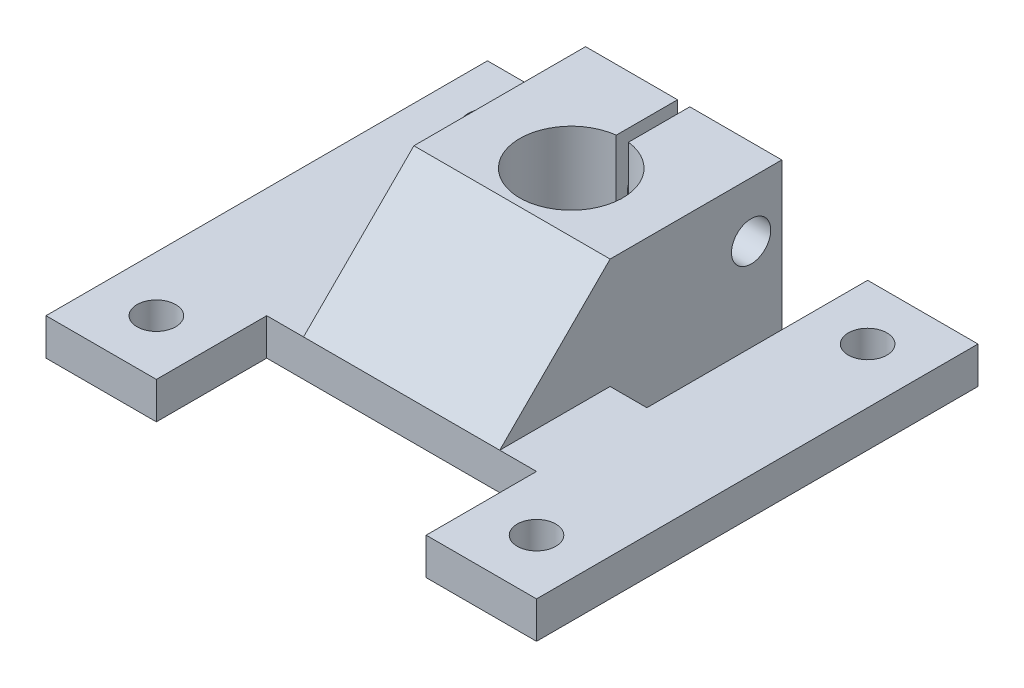
ISO-10303-21;
HEADER;
FILE_DESCRIPTION(('STEP AP214'),'2;1');
FILE_NAME('part.step','',(''),(''),'','','');
FILE_SCHEMA(('AUTOMOTIVE_DESIGN { 1 0 10303 214 1 1 1 1 }'));
ENDSEC;
DATA;
#1=APPLICATION_CONTEXT('core data for automotive mechanical design processes');
#2=APPLICATION_PROTOCOL_DEFINITION('international standard','automotive_design',2000,#1);
#3=PRODUCT_CONTEXT('',#1,'mechanical');
#4=PRODUCT('Part','Part','',(#3));
#5=PRODUCT_RELATED_PRODUCT_CATEGORY('part','',(#4));
#6=PRODUCT_DEFINITION_FORMATION('','',#4);
#7=PRODUCT_DEFINITION_CONTEXT('part definition',#1,'design');
#8=PRODUCT_DEFINITION('design','',#6,#7);
#9=PRODUCT_DEFINITION_SHAPE('','',#8);
#10=(LENGTH_UNIT() NAMED_UNIT(*) SI_UNIT(.MILLI.,.METRE.));
#11=(NAMED_UNIT(*) PLANE_ANGLE_UNIT() SI_UNIT($,.RADIAN.));
#12=(NAMED_UNIT(*) SI_UNIT($,.STERADIAN.) SOLID_ANGLE_UNIT());
#13=UNCERTAINTY_MEASURE_WITH_UNIT(LENGTH_MEASURE(1.E-05),#10,'distance_accuracy_value','');
#14=(GEOMETRIC_REPRESENTATION_CONTEXT(3) GLOBAL_UNCERTAINTY_ASSIGNED_CONTEXT((#13)) GLOBAL_UNIT_ASSIGNED_CONTEXT((#10,
#11,#12)) REPRESENTATION_CONTEXT('',''));
#15=CARTESIAN_POINT('',(0.,0.,0.));
#16=DIRECTION('',(0.,0.,1.));
#17=DIRECTION('',(1.,0.,0.));
#18=AXIS2_PLACEMENT_3D('',#15,#16,#17);
#19=CARTESIAN_POINT('',(0.,3.,0.));
#20=DIRECTION('',(0.,1.,0.));
#21=DIRECTION('',(0.,0.,1.));
#22=AXIS2_PLACEMENT_3D('',#19,#20,#21);
#23=PLANE('',#22);
#24=CARTESIAN_POINT('',(35.4999999999998,3.,4.5));
#25=DIRECTION('',(0.,1.,0.));
#26=DIRECTION('',(0.,0.,1.));
#27=AXIS2_PLACEMENT_3D('',#24,#25,#26);
#28=CIRCLE('',#27,1.575);
#29=CARTESIAN_POINT('',(35.4999999999998,3.,6.075));
#30=VERTEX_POINT('',#29);
#31=EDGE_CURVE('E199',#30,#30,#28,.F.);
#32=ORIENTED_EDGE('',*,*,#31,.T.);
#33=EDGE_LOOP('',(#32));
#34=FACE_BOUND('',#33,.T.);
#35=CARTESIAN_POINT('',(35.5,3.,31.5));
#36=DIRECTION('',(0.,1.,0.));
#37=DIRECTION('',(0.,0.,1.));
#38=AXIS2_PLACEMENT_3D('',#35,#36,#37);
#39=CIRCLE('',#38,1.575);
#40=CARTESIAN_POINT('',(35.5,3.,33.075));
#41=VERTEX_POINT('',#40);
#42=EDGE_CURVE('E196',#41,#41,#39,.F.);
#43=ORIENTED_EDGE('',*,*,#42,.T.);
#44=EDGE_LOOP('',(#43));
#45=FACE_BOUND('',#44,.T.);
#46=DIRECTION('',(1.,0.,0.));
#47=VECTOR('',#46,1.);
#48=CARTESIAN_POINT('',(0.,3.,18.));
#49=LINE('',#48,#47);
#50=CARTESIAN_POINT('',(28.,3.,18.));
#51=VERTEX_POINT('',#50);
#52=CARTESIAN_POINT('',(31.,3.,18.));
#53=VERTEX_POINT('',#52);
#54=EDGE_CURVE('E190',#51,#53,#49,.T.);
#55=ORIENTED_EDGE('',*,*,#54,.F.);
#56=DIRECTION('',(0.,0.,1.));
#57=VECTOR('',#56,1.);
#58=CARTESIAN_POINT('',(28.,3.,0.));
#59=LINE('',#58,#57);
#60=CARTESIAN_POINT('',(28.,3.,27.));
#61=VERTEX_POINT('',#60);
#62=EDGE_CURVE('E385',#51,#61,#59,.T.);
#63=ORIENTED_EDGE('',*,*,#62,.T.);
#64=DIRECTION('',(-1.,0.,0.));
#65=VECTOR('',#64,1.);
#66=CARTESIAN_POINT('',(0.,3.,27.));
#67=LINE('',#66,#65);
#68=CARTESIAN_POINT('',(31.,3.,27.));
#69=VERTEX_POINT('',#68);
#70=EDGE_CURVE('E361',#69,#61,#67,.T.);
#71=ORIENTED_EDGE('',*,*,#70,.F.);
#72=DIRECTION('',(0.,0.,-1.));
#73=VECTOR('',#72,1.);
#74=CARTESIAN_POINT('',(31.,3.,0.));
#75=LINE('',#74,#73);
#76=CARTESIAN_POINT('',(31.,3.,36.));
#77=VERTEX_POINT('',#76);
#78=EDGE_CURVE('E364',#77,#69,#75,.T.);
#79=ORIENTED_EDGE('',*,*,#78,.F.);
#80=DIRECTION('',(-1.,0.,0.));
#81=VECTOR('',#80,1.);
#82=CARTESIAN_POINT('',(0.,3.,36.));
#83=LINE('',#82,#81);
#84=CARTESIAN_POINT('',(40.,3.,36.));
#85=VERTEX_POINT('',#84);
#86=EDGE_CURVE('E185',#85,#77,#83,.T.);
#87=ORIENTED_EDGE('',*,*,#86,.F.);
#88=DIRECTION('',(0.,0.,1.));
#89=VECTOR('',#88,1.);
#90=CARTESIAN_POINT('',(40.,3.,0.));
#91=LINE('',#90,#89);
#92=CARTESIAN_POINT('',(40.,3.,0.));
#93=VERTEX_POINT('',#92);
#94=EDGE_CURVE('E168',#93,#85,#91,.T.);
#95=ORIENTED_EDGE('',*,*,#94,.F.);
#96=DIRECTION('',(1.,0.,0.));
#97=VECTOR('',#96,1.);
#98=CARTESIAN_POINT('',(0.,3.,0.));
#99=LINE('',#98,#97);
#100=CARTESIAN_POINT('',(31.,3.,0.));
#101=VERTEX_POINT('',#100);
#102=EDGE_CURVE('E182',#101,#93,#99,.T.);
#103=ORIENTED_EDGE('',*,*,#102,.F.);
#104=DIRECTION('',(0.,0.,-1.));
#105=VECTOR('',#104,1.);
#106=CARTESIAN_POINT('',(31.,3.,0.));
#107=LINE('',#106,#105);
#108=EDGE_CURVE('E188',#53,#101,#107,.T.);
#109=ORIENTED_EDGE('',*,*,#108,.F.);
#110=EDGE_LOOP('',(#55,#63,#71,#79,#87,#95,#103,#109));
#111=FACE_BOUND('',#110,.T.);
#112=ADVANCED_FACE('F35',(#34,#45,#111),#23,.T.);
#113=CARTESIAN_POINT('',(20.,3.,13.1701318923986));
#114=DIRECTION('',(0.,-1.,0.));
#115=DIRECTION('',(0.,0.,-1.));
#116=AXIS2_PLACEMENT_3D('',#113,#114,#115);
#117=CYLINDRICAL_SURFACE('',#116,4.2);
#118=CARTESIAN_POINT('',(20.,0.,13.1701318923986));
#119=DIRECTION('',(0.,1.,0.));
#120=DIRECTION('',(0.,0.,1.));
#121=AXIS2_PLACEMENT_3D('',#118,#119,#120);
#122=CIRCLE('',#121,4.2);
#123=CARTESIAN_POINT('',(19.5,0.,9.));
#124=VERTEX_POINT('',#123);
#125=CARTESIAN_POINT('',(20.5,0.,9.));
#126=VERTEX_POINT('',#125);
#127=EDGE_CURVE('E208',#124,#126,#122,.T.);
#128=ORIENTED_EDGE('',*,*,#127,.F.);
#129=DIRECTION('',(0.,-1.,0.));
#130=VECTOR('',#129,1.);
#131=CARTESIAN_POINT('',(19.5,3.,9.));
#132=LINE('',#131,#130);
#133=CARTESIAN_POINT('',(19.5,12.,9.));
#134=VERTEX_POINT('',#133);
#135=EDGE_CURVE('E11',#134,#124,#132,.T.);
#136=ORIENTED_EDGE('',*,*,#135,.F.);
#137=CARTESIAN_POINT('',(20.,12.,13.1701318923986));
#138=DIRECTION('',(0.,1.,0.));
#139=DIRECTION('',(0.,0.,1.));
#140=AXIS2_PLACEMENT_3D('',#137,#138,#139);
#141=CIRCLE('',#140,4.2);
#142=CARTESIAN_POINT('',(20.5,12.,9.));
#143=VERTEX_POINT('',#142);
#144=EDGE_CURVE('E340',#143,#134,#141,.F.);
#145=ORIENTED_EDGE('',*,*,#144,.F.);
#146=DIRECTION('',(0.,-1.,0.));
#147=VECTOR('',#146,1.);
#148=CARTESIAN_POINT('',(20.5,3.,9.));
#149=LINE('',#148,#147);
#150=EDGE_CURVE('E126',#143,#126,#149,.T.);
#151=ORIENTED_EDGE('',*,*,#150,.T.);
#152=EDGE_LOOP('',(#128,#136,#145,#151));
#153=FACE_BOUND('',#152,.T.);
#154=ADVANCED_FACE('F37',(#153),#117,.F.);
#155=CARTESIAN_POINT('',(19.5,3.,0.));
#156=DIRECTION('',(1.,0.,0.));
#157=DIRECTION('',(0.,0.,-1.));
#158=AXIS2_PLACEMENT_3D('',#155,#156,#157);
#159=PLANE('',#158);
#160=CARTESIAN_POINT('',(19.5,7.5,6.5));
#161=DIRECTION('',(1.,0.,0.));
#162=DIRECTION('',(0.,0.,-1.));
#163=AXIS2_PLACEMENT_3D('',#160,#161,#162);
#164=CIRCLE('',#163,1.6);
#165=CARTESIAN_POINT('',(19.5,7.5,4.9));
#166=VERTEX_POINT('',#165);
#167=EDGE_CURVE('E559',#166,#166,#164,.T.);
#168=ORIENTED_EDGE('',*,*,#167,.F.);
#169=EDGE_LOOP('',(#168));
#170=FACE_BOUND('',#169,.T.);
#171=DIRECTION('',(0.,0.,1.));
#172=VECTOR('',#171,1.);
#173=CARTESIAN_POINT('',(19.5,0.,0.));
#174=LINE('',#173,#172);
#175=CARTESIAN_POINT('',(19.5,0.,4.));
#176=VERTEX_POINT('',#175);
#177=EDGE_CURVE('E210',#176,#124,#174,.T.);
#178=ORIENTED_EDGE('',*,*,#177,.F.);
#179=DIRECTION('',(0.,-1.,0.));
#180=VECTOR('',#179,1.);
#181=CARTESIAN_POINT('',(19.5,3.,4.));
#182=LINE('',#181,#180);
#183=CARTESIAN_POINT('',(19.5,12.,4.));
#184=VERTEX_POINT('',#183);
#185=EDGE_CURVE('E45',#184,#176,#182,.T.);
#186=ORIENTED_EDGE('',*,*,#185,.F.);
#187=DIRECTION('',(0.,0.,-1.));
#188=VECTOR('',#187,1.);
#189=CARTESIAN_POINT('',(19.5,12.,0.));
#190=LINE('',#189,#188);
#191=EDGE_CURVE('E338',#134,#184,#190,.T.);
#192=ORIENTED_EDGE('',*,*,#191,.F.);
#193=ORIENTED_EDGE('',*,*,#135,.T.);
#194=EDGE_LOOP('',(#178,#186,#192,#193));
#195=FACE_BOUND('',#194,.T.);
#196=ADVANCED_FACE('F318',(#170,#195),#159,.T.);
#197=CARTESIAN_POINT('',(0.,3.,4.));
#198=DIRECTION('',(0.,0.,-1.));
#199=DIRECTION('',(-1.,0.,0.));
#200=AXIS2_PLACEMENT_3D('',#197,#198,#199);
#201=PLANE('',#200);
#202=DIRECTION('',(1.,0.,0.));
#203=VECTOR('',#202,1.);
#204=CARTESIAN_POINT('',(0.,0.,4.));
#205=LINE('',#204,#203);
#206=CARTESIAN_POINT('',(12.,0.,4.));
#207=VERTEX_POINT('',#206);
#208=EDGE_CURVE('E214',#207,#176,#205,.T.);
#209=ORIENTED_EDGE('',*,*,#208,.F.);
#210=DIRECTION('',(0.,-1.,0.));
#211=VECTOR('',#210,1.);
#212=CARTESIAN_POINT('',(12.,3.,4.));
#213=LINE('',#212,#211);
#214=CARTESIAN_POINT('',(12.,12.,4.));
#215=VERTEX_POINT('',#214);
#216=EDGE_CURVE('E304',#215,#207,#213,.T.);
#217=ORIENTED_EDGE('',*,*,#216,.F.);
#218=DIRECTION('',(-1.,0.,0.));
#219=VECTOR('',#218,1.);
#220=CARTESIAN_POINT('',(0.,12.,4.));
#221=LINE('',#220,#219);
#222=EDGE_CURVE('E211',#184,#215,#221,.T.);
#223=ORIENTED_EDGE('',*,*,#222,.F.);
#224=ORIENTED_EDGE('',*,*,#185,.T.);
#225=EDGE_LOOP('',(#209,#217,#223,#224));
#226=FACE_BOUND('',#225,.T.);
#227=ADVANCED_FACE('F311',(#226),#201,.T.);
#228=CARTESIAN_POINT('',(12.,3.,0.));
#229=DIRECTION('',(1.,0.,0.));
#230=DIRECTION('',(0.,0.,-1.));
#231=AXIS2_PLACEMENT_3D('',#228,#229,#230);
#232=PLANE('',#231);
#233=CARTESIAN_POINT('',(12.,7.5,6.5));
#234=DIRECTION('',(-1.,0.,0.));
#235=DIRECTION('',(0.,0.,1.));
#236=AXIS2_PLACEMENT_3D('',#233,#234,#235);
#237=CIRCLE('',#236,1.6);
#238=CARTESIAN_POINT('',(12.,7.5,8.1));
#239=VERTEX_POINT('',#238);
#240=EDGE_CURVE('E566',#239,#239,#237,.T.);
#241=ORIENTED_EDGE('',*,*,#240,.F.);
#242=EDGE_LOOP('',(#241));
#243=FACE_BOUND('',#242,.T.);
#244=DIRECTION('',(0.,0.,1.));
#245=VECTOR('',#244,1.);
#246=CARTESIAN_POINT('',(12.,0.,0.));
#247=LINE('',#246,#245);
#248=CARTESIAN_POINT('',(12.,0.,18.));
#249=VERTEX_POINT('',#248);
#250=EDGE_CURVE('E217',#207,#249,#247,.T.);
#251=ORIENTED_EDGE('',*,*,#250,.T.);
#252=DIRECTION('',(0.,-1.,0.));
#253=VECTOR('',#252,1.);
#254=CARTESIAN_POINT('',(12.,3.,18.));
#255=LINE('',#254,#253);
#256=CARTESIAN_POINT('',(12.,3.,18.));
#257=VERTEX_POINT('',#256);
#258=EDGE_CURVE('E302',#257,#249,#255,.T.);
#259=ORIENTED_EDGE('',*,*,#258,.F.);
#260=DIRECTION('',(0.,0.,1.));
#261=VECTOR('',#260,1.);
#262=CARTESIAN_POINT('',(12.,3.,0.));
#263=LINE('',#262,#261);
#264=CARTESIAN_POINT('',(12.,3.,27.));
#265=VERTEX_POINT('',#264);
#266=EDGE_CURVE('E390',#257,#265,#263,.T.);
#267=ORIENTED_EDGE('',*,*,#266,.T.);
#268=DIRECTION('',(0.,-0.707106781186548,0.707106781186547));
#269=VECTOR('',#268,1.);
#270=CARTESIAN_POINT('',(12.,12.,18.));
#271=LINE('',#270,#269);
#272=CARTESIAN_POINT('',(12.,12.,18.));
#273=VERTEX_POINT('',#272);
#274=EDGE_CURVE('E391',#273,#265,#271,.T.);
#275=ORIENTED_EDGE('',*,*,#274,.F.);
#276=DIRECTION('',(0.,0.,1.));
#277=VECTOR('',#276,1.);
#278=CARTESIAN_POINT('',(12.,12.,0.));
#279=LINE('',#278,#277);
#280=EDGE_CURVE('E332',#215,#273,#279,.T.);
#281=ORIENTED_EDGE('',*,*,#280,.F.);
#282=ORIENTED_EDGE('',*,*,#216,.T.);
#283=EDGE_LOOP('',(#251,#259,#267,#275,#281,#282));
#284=FACE_BOUND('',#283,.T.);
#285=ADVANCED_FACE('F326',(#243,#284),#232,.F.);
#286=CARTESIAN_POINT('',(0.,3.,18.));
#287=DIRECTION('',(0.,0.,-1.));
#288=DIRECTION('',(-1.,0.,0.));
#289=AXIS2_PLACEMENT_3D('',#286,#287,#288);
#290=PLANE('',#289);
#291=DIRECTION('',(1.,0.,0.));
#292=VECTOR('',#291,1.);
#293=CARTESIAN_POINT('',(0.,0.,18.));
#294=LINE('',#293,#292);
#295=CARTESIAN_POINT('',(9.,0.,18.));
#296=VERTEX_POINT('',#295);
#297=EDGE_CURVE('E220',#296,#249,#294,.T.);
#298=ORIENTED_EDGE('',*,*,#297,.F.);
#299=DIRECTION('',(0.,-1.,0.));
#300=VECTOR('',#299,1.);
#301=CARTESIAN_POINT('',(9.,3.,18.));
#302=LINE('',#301,#300);
#303=CARTESIAN_POINT('',(9.,3.,18.));
#304=VERTEX_POINT('',#303);
#305=EDGE_CURVE('E134',#304,#296,#302,.T.);
#306=ORIENTED_EDGE('',*,*,#305,.F.);
#307=DIRECTION('',(1.,0.,0.));
#308=VECTOR('',#307,1.);
#309=CARTESIAN_POINT('',(0.,3.,18.));
#310=LINE('',#309,#308);
#311=EDGE_CURVE('E276',#304,#257,#310,.T.);
#312=ORIENTED_EDGE('',*,*,#311,.T.);
#313=ORIENTED_EDGE('',*,*,#258,.T.);
#314=EDGE_LOOP('',(#298,#306,#312,#313));
#315=FACE_BOUND('',#314,.T.);
#316=ADVANCED_FACE('F459',(#315),#290,.T.);
#317=CARTESIAN_POINT('',(9.,3.,0.));
#318=DIRECTION('',(1.,0.,0.));
#319=DIRECTION('',(0.,0.,-1.));
#320=AXIS2_PLACEMENT_3D('',#317,#318,#319);
#321=PLANE('',#320);
#322=DIRECTION('',(0.,0.,1.));
#323=VECTOR('',#322,1.);
#324=CARTESIAN_POINT('',(9.,0.,0.));
#325=LINE('',#324,#323);
#326=CARTESIAN_POINT('',(9.,0.,0.));
#327=VERTEX_POINT('',#326);
#328=EDGE_CURVE('E223',#327,#296,#325,.T.);
#329=ORIENTED_EDGE('',*,*,#328,.F.);
#330=DIRECTION('',(0.,-1.,0.));
#331=VECTOR('',#330,1.);
#332=CARTESIAN_POINT('',(9.,3.,0.));
#333=LINE('',#332,#331);
#334=CARTESIAN_POINT('',(9.,3.,0.));
#335=VERTEX_POINT('',#334);
#336=EDGE_CURVE('E299',#335,#327,#333,.T.);
#337=ORIENTED_EDGE('',*,*,#336,.F.);
#338=DIRECTION('',(0.,0.,1.));
#339=VECTOR('',#338,1.);
#340=CARTESIAN_POINT('',(9.,3.,0.));
#341=LINE('',#340,#339);
#342=EDGE_CURVE('E345',#335,#304,#341,.T.);
#343=ORIENTED_EDGE('',*,*,#342,.T.);
#344=ORIENTED_EDGE('',*,*,#305,.T.);
#345=EDGE_LOOP('',(#329,#337,#343,#344));
#346=FACE_BOUND('',#345,.T.);
#347=ADVANCED_FACE('F458',(#346),#321,.T.);
#348=CARTESIAN_POINT('',(0.,3.,0.));
#349=DIRECTION('',(0.,0.,-1.));
#350=DIRECTION('',(-1.,0.,0.));
#351=AXIS2_PLACEMENT_3D('',#348,#349,#350);
#352=PLANE('',#351);
#353=DIRECTION('',(1.,0.,0.));
#354=VECTOR('',#353,1.);
#355=CARTESIAN_POINT('',(0.,0.,0.));
#356=LINE('',#355,#354);
#357=CARTESIAN_POINT('',(0.,0.,0.));
#358=VERTEX_POINT('',#357);
#359=EDGE_CURVE('E226',#358,#327,#356,.T.);
#360=ORIENTED_EDGE('',*,*,#359,.F.);
#361=DIRECTION('',(0.,-1.,0.));
#362=VECTOR('',#361,1.);
#363=CARTESIAN_POINT('',(0.,3.,0.));
#364=LINE('',#363,#362);
#365=CARTESIAN_POINT('',(0.,3.,0.));
#366=VERTEX_POINT('',#365);
#367=EDGE_CURVE('E297',#366,#358,#364,.T.);
#368=ORIENTED_EDGE('',*,*,#367,.F.);
#369=DIRECTION('',(1.,0.,0.));
#370=VECTOR('',#369,1.);
#371=CARTESIAN_POINT('',(0.,3.,0.));
#372=LINE('',#371,#370);
#373=EDGE_CURVE('E348',#366,#335,#372,.T.);
#374=ORIENTED_EDGE('',*,*,#373,.T.);
#375=ORIENTED_EDGE('',*,*,#336,.T.);
#376=EDGE_LOOP('',(#360,#368,#374,#375));
#377=FACE_BOUND('',#376,.T.);
#378=ADVANCED_FACE('F454',(#377),#352,.T.);
#379=CARTESIAN_POINT('',(0.,3.,0.));
#380=DIRECTION('',(-1.,0.,0.));
#381=DIRECTION('',(0.,0.,1.));
#382=AXIS2_PLACEMENT_3D('',#379,#380,#381);
#383=PLANE('',#382);
#384=DIRECTION('',(0.,0.,-1.));
#385=VECTOR('',#384,1.);
#386=CARTESIAN_POINT('',(0.,0.,0.));
#387=LINE('',#386,#385);
#388=CARTESIAN_POINT('',(0.,0.,36.));
#389=VERTEX_POINT('',#388);
#390=EDGE_CURVE('E229',#389,#358,#387,.T.);
#391=ORIENTED_EDGE('',*,*,#390,.F.);
#392=DIRECTION('',(0.,-1.,0.));
#393=VECTOR('',#392,1.);
#394=CARTESIAN_POINT('',(0.,3.,36.));
#395=LINE('',#394,#393);
#396=CARTESIAN_POINT('',(0.,3.,36.));
#397=VERTEX_POINT('',#396);
#398=EDGE_CURVE('E295',#397,#389,#395,.T.);
#399=ORIENTED_EDGE('',*,*,#398,.F.);
#400=DIRECTION('',(0.,0.,-1.));
#401=VECTOR('',#400,1.);
#402=CARTESIAN_POINT('',(0.,3.,0.));
#403=LINE('',#402,#401);
#404=EDGE_CURVE('E351',#397,#366,#403,.T.);
#405=ORIENTED_EDGE('',*,*,#404,.T.);
#406=ORIENTED_EDGE('',*,*,#367,.T.);
#407=EDGE_LOOP('',(#391,#399,#405,#406));
#408=FACE_BOUND('',#407,.T.);
#409=ADVANCED_FACE('F450',(#408),#383,.T.);
#410=CARTESIAN_POINT('',(0.,3.,36.));
#411=DIRECTION('',(0.,0.,1.));
#412=DIRECTION('',(1.,0.,0.));
#413=AXIS2_PLACEMENT_3D('',#410,#411,#412);
#414=PLANE('',#413);
#415=DIRECTION('',(-1.,0.,0.));
#416=VECTOR('',#415,1.);
#417=CARTESIAN_POINT('',(0.,0.,36.));
#418=LINE('',#417,#416);
#419=CARTESIAN_POINT('',(9.00000000000001,0.,36.));
#420=VERTEX_POINT('',#419);
#421=EDGE_CURVE('E232',#420,#389,#418,.T.);
#422=ORIENTED_EDGE('',*,*,#421,.F.);
#423=DIRECTION('',(0.,-1.,0.));
#424=VECTOR('',#423,1.);
#425=CARTESIAN_POINT('',(9.00000000000001,3.,36.));
#426=LINE('',#425,#424);
#427=CARTESIAN_POINT('',(9.00000000000001,3.,36.));
#428=VERTEX_POINT('',#427);
#429=EDGE_CURVE('E293',#428,#420,#426,.T.);
#430=ORIENTED_EDGE('',*,*,#429,.F.);
#431=DIRECTION('',(-1.,0.,0.));
#432=VECTOR('',#431,1.);
#433=CARTESIAN_POINT('',(0.,3.,36.));
#434=LINE('',#433,#432);
#435=EDGE_CURVE('E354',#428,#397,#434,.T.);
#436=ORIENTED_EDGE('',*,*,#435,.T.);
#437=ORIENTED_EDGE('',*,*,#398,.T.);
#438=EDGE_LOOP('',(#422,#430,#436,#437));
#439=FACE_BOUND('',#438,.T.);
#440=ADVANCED_FACE('F446',(#439),#414,.T.);
#441=CARTESIAN_POINT('',(9.00000000000001,3.,0.));
#442=DIRECTION('',(1.,0.,0.));
#443=DIRECTION('',(0.,0.,-1.));
#444=AXIS2_PLACEMENT_3D('',#441,#442,#443);
#445=PLANE('',#444);
#446=DIRECTION('',(0.,0.,1.));
#447=VECTOR('',#446,1.);
#448=CARTESIAN_POINT('',(9.00000000000001,0.,0.));
#449=LINE('',#448,#447);
#450=CARTESIAN_POINT('',(9.00000000000001,0.,27.));
#451=VERTEX_POINT('',#450);
#452=EDGE_CURVE('E235',#451,#420,#449,.T.);
#453=ORIENTED_EDGE('',*,*,#452,.F.);
#454=DIRECTION('',(0.,-1.,0.));
#455=VECTOR('',#454,1.);
#456=CARTESIAN_POINT('',(9.00000000000001,3.,27.));
#457=LINE('',#456,#455);
#458=CARTESIAN_POINT('',(9.00000000000001,3.,27.));
#459=VERTEX_POINT('',#458);
#460=EDGE_CURVE('E290',#459,#451,#457,.T.);
#461=ORIENTED_EDGE('',*,*,#460,.F.);
#462=DIRECTION('',(0.,0.,1.));
#463=VECTOR('',#462,1.);
#464=CARTESIAN_POINT('',(9.00000000000001,3.,0.));
#465=LINE('',#464,#463);
#466=EDGE_CURVE('E357',#459,#428,#465,.T.);
#467=ORIENTED_EDGE('',*,*,#466,.T.);
#468=ORIENTED_EDGE('',*,*,#429,.T.);
#469=EDGE_LOOP('',(#453,#461,#467,#468));
#470=FACE_BOUND('',#469,.T.);
#471=ADVANCED_FACE('F442',(#470),#445,.T.);
#472=CARTESIAN_POINT('',(0.,3.,27.));
#473=DIRECTION('',(0.,0.,1.));
#474=DIRECTION('',(1.,0.,0.));
#475=AXIS2_PLACEMENT_3D('',#472,#473,#474);
#476=PLANE('',#475);
#477=ORIENTED_EDGE('',*,*,#460,.T.);
#478=DIRECTION('',(-1.,0.,0.));
#479=VECTOR('',#478,1.);
#480=CARTESIAN_POINT('',(0.,0.,27.));
#481=LINE('',#480,#479);
#482=CARTESIAN_POINT('',(31.,0.,27.));
#483=VERTEX_POINT('',#482);
#484=EDGE_CURVE('E238',#483,#451,#481,.T.);
#485=ORIENTED_EDGE('',*,*,#484,.F.);
#486=DIRECTION('',(0.,-1.,0.));
#487=VECTOR('',#486,1.);
#488=CARTESIAN_POINT('',(31.,3.,27.));
#489=LINE('',#488,#487);
#490=EDGE_CURVE('E288',#69,#483,#489,.T.);
#491=ORIENTED_EDGE('',*,*,#490,.F.);
#492=ORIENTED_EDGE('',*,*,#70,.T.);
#493=DIRECTION('',(-1.,0.,0.));
#494=VECTOR('',#493,1.);
#495=CARTESIAN_POINT('',(0.,3.,27.));
#496=LINE('',#495,#494);
#497=EDGE_CURVE('E393',#265,#61,#496,.F.);
#498=ORIENTED_EDGE('',*,*,#497,.F.);
#499=EDGE_CURVE('E360',#265,#459,#67,.T.);
#500=ORIENTED_EDGE('',*,*,#499,.T.);
#501=EDGE_LOOP('',(#477,#485,#491,#492,#498,#500));
#502=FACE_BOUND('',#501,.T.);
#503=ADVANCED_FACE('F434',(#502),#476,.T.);
#504=CARTESIAN_POINT('',(31.,3.,0.));
#505=DIRECTION('',(-1.,0.,0.));
#506=DIRECTION('',(0.,0.,1.));
#507=AXIS2_PLACEMENT_3D('',#504,#505,#506);
#508=PLANE('',#507);
#509=DIRECTION('',(0.,0.,-1.));
#510=VECTOR('',#509,1.);
#511=CARTESIAN_POINT('',(31.,0.,0.));
#512=LINE('',#511,#510);
#513=CARTESIAN_POINT('',(31.,0.,36.));
#514=VERTEX_POINT('',#513);
#515=EDGE_CURVE('E240',#514,#483,#512,.T.);
#516=ORIENTED_EDGE('',*,*,#515,.F.);
#517=DIRECTION('',(0.,-1.,0.));
#518=VECTOR('',#517,1.);
#519=CARTESIAN_POINT('',(31.,3.,36.));
#520=LINE('',#519,#518);
#521=EDGE_CURVE('E286',#77,#514,#520,.T.);
#522=ORIENTED_EDGE('',*,*,#521,.F.);
#523=ORIENTED_EDGE('',*,*,#78,.T.);
#524=ORIENTED_EDGE('',*,*,#490,.T.);
#525=EDGE_LOOP('',(#516,#522,#523,#524));
#526=FACE_BOUND('',#525,.T.);
#527=ADVANCED_FACE('F438',(#526),#508,.T.);
#528=CARTESIAN_POINT('',(0.,3.,36.));
#529=DIRECTION('',(0.,0.,1.));
#530=DIRECTION('',(1.,0.,0.));
#531=AXIS2_PLACEMENT_3D('',#528,#529,#530);
#532=PLANE('',#531);
#533=DIRECTION('',(-1.,0.,0.));
#534=VECTOR('',#533,1.);
#535=CARTESIAN_POINT('',(0.,0.,36.));
#536=LINE('',#535,#534);
#537=CARTESIAN_POINT('',(40.,0.,36.));
#538=VERTEX_POINT('',#537);
#539=EDGE_CURVE('E243',#538,#514,#536,.T.);
#540=ORIENTED_EDGE('',*,*,#539,.F.);
#541=DIRECTION('',(0.,-1.,0.));
#542=VECTOR('',#541,1.);
#543=CARTESIAN_POINT('',(40.,3.,36.));
#544=LINE('',#543,#542);
#545=EDGE_CURVE('E175',#85,#538,#544,.T.);
#546=ORIENTED_EDGE('',*,*,#545,.F.);
#547=ORIENTED_EDGE('',*,*,#86,.T.);
#548=ORIENTED_EDGE('',*,*,#521,.T.);
#549=EDGE_LOOP('',(#540,#546,#547,#548));
#550=FACE_BOUND('',#549,.T.);
#551=ADVANCED_FACE('F368',(#550),#532,.T.);
#552=CARTESIAN_POINT('',(40.,3.,0.));
#553=DIRECTION('',(1.,0.,0.));
#554=DIRECTION('',(0.,0.,-1.));
#555=AXIS2_PLACEMENT_3D('',#552,#553,#554);
#556=PLANE('',#555);
#557=DIRECTION('',(0.,0.,1.));
#558=VECTOR('',#557,1.);
#559=CARTESIAN_POINT('',(40.,0.,0.));
#560=LINE('',#559,#558);
#561=CARTESIAN_POINT('',(40.,0.,0.));
#562=VERTEX_POINT('',#561);
#563=EDGE_CURVE('E170',#562,#538,#560,.T.);
#564=ORIENTED_EDGE('',*,*,#563,.F.);
#565=DIRECTION('',(0.,-1.,0.));
#566=VECTOR('',#565,1.);
#567=CARTESIAN_POINT('',(40.,3.,0.));
#568=LINE('',#567,#566);
#569=EDGE_CURVE('E165',#93,#562,#568,.T.);
#570=ORIENTED_EDGE('',*,*,#569,.F.);
#571=ORIENTED_EDGE('',*,*,#94,.T.);
#572=ORIENTED_EDGE('',*,*,#545,.T.);
#573=EDGE_LOOP('',(#564,#570,#571,#572));
#574=FACE_BOUND('',#573,.T.);
#575=ADVANCED_FACE('F167',(#574),#556,.T.);
#576=CARTESIAN_POINT('',(0.,3.,0.));
#577=DIRECTION('',(0.,0.,-1.));
#578=DIRECTION('',(-1.,0.,0.));
#579=AXIS2_PLACEMENT_3D('',#576,#577,#578);
#580=PLANE('',#579);
#581=DIRECTION('',(1.,0.,0.));
#582=VECTOR('',#581,1.);
#583=CARTESIAN_POINT('',(0.,0.,0.));
#584=LINE('',#583,#582);
#585=CARTESIAN_POINT('',(31.,0.,0.));
#586=VERTEX_POINT('',#585);
#587=EDGE_CURVE('E247',#586,#562,#584,.T.);
#588=ORIENTED_EDGE('',*,*,#587,.F.);
#589=DIRECTION('',(0.,-1.,0.));
#590=VECTOR('',#589,1.);
#591=CARTESIAN_POINT('',(31.,3.,0.));
#592=LINE('',#591,#590);
#593=EDGE_CURVE('E176',#101,#586,#592,.T.);
#594=ORIENTED_EDGE('',*,*,#593,.F.);
#595=ORIENTED_EDGE('',*,*,#102,.T.);
#596=ORIENTED_EDGE('',*,*,#569,.T.);
#597=EDGE_LOOP('',(#588,#594,#595,#596));
#598=FACE_BOUND('',#597,.T.);
#599=ADVANCED_FACE('F187',(#598),#580,.T.);
#600=CARTESIAN_POINT('',(31.,3.,0.));
#601=DIRECTION('',(-1.,0.,0.));
#602=DIRECTION('',(0.,0.,1.));
#603=AXIS2_PLACEMENT_3D('',#600,#601,#602);
#604=PLANE('',#603);
#605=DIRECTION('',(0.,0.,-1.));
#606=VECTOR('',#605,1.);
#607=CARTESIAN_POINT('',(31.,0.,0.));
#608=LINE('',#607,#606);
#609=CARTESIAN_POINT('',(31.,0.,18.));
#610=VERTEX_POINT('',#609);
#611=EDGE_CURVE('E249',#610,#586,#608,.T.);
#612=ORIENTED_EDGE('',*,*,#611,.F.);
#613=DIRECTION('',(0.,-1.,0.));
#614=VECTOR('',#613,1.);
#615=CARTESIAN_POINT('',(31.,3.,18.));
#616=LINE('',#615,#614);
#617=EDGE_CURVE('E53',#53,#610,#616,.T.);
#618=ORIENTED_EDGE('',*,*,#617,.F.);
#619=ORIENTED_EDGE('',*,*,#108,.T.);
#620=ORIENTED_EDGE('',*,*,#593,.T.);
#621=EDGE_LOOP('',(#612,#618,#619,#620));
#622=FACE_BOUND('',#621,.T.);
#623=ADVANCED_FACE('F371',(#622),#604,.T.);
#624=CARTESIAN_POINT('',(0.,3.,18.));
#625=DIRECTION('',(0.,0.,-1.));
#626=DIRECTION('',(-1.,0.,0.));
#627=AXIS2_PLACEMENT_3D('',#624,#625,#626);
#628=PLANE('',#627);
#629=DIRECTION('',(1.,0.,0.));
#630=VECTOR('',#629,1.);
#631=CARTESIAN_POINT('',(0.,0.,18.));
#632=LINE('',#631,#630);
#633=CARTESIAN_POINT('',(28.,0.,18.));
#634=VERTEX_POINT('',#633);
#635=EDGE_CURVE('E252',#634,#610,#632,.T.);
#636=ORIENTED_EDGE('',*,*,#635,.F.);
#637=DIRECTION('',(0.,-1.,0.));
#638=VECTOR('',#637,1.);
#639=CARTESIAN_POINT('',(28.,3.,18.));
#640=LINE('',#639,#638);
#641=EDGE_CURVE('E281',#51,#634,#640,.T.);
#642=ORIENTED_EDGE('',*,*,#641,.F.);
#643=ORIENTED_EDGE('',*,*,#54,.T.);
#644=ORIENTED_EDGE('',*,*,#617,.T.);
#645=EDGE_LOOP('',(#636,#642,#643,#644));
#646=FACE_BOUND('',#645,.T.);
#647=ADVANCED_FACE('F376',(#646),#628,.T.);
#648=CARTESIAN_POINT('',(28.,3.,0.));
#649=DIRECTION('',(1.,0.,0.));
#650=DIRECTION('',(0.,0.,-1.));
#651=AXIS2_PLACEMENT_3D('',#648,#649,#650);
#652=PLANE('',#651);
#653=CARTESIAN_POINT('',(28.,7.5,6.5));
#654=DIRECTION('',(1.,0.,0.));
#655=DIRECTION('',(0.,0.,-1.));
#656=AXIS2_PLACEMENT_3D('',#653,#654,#655);
#657=CIRCLE('',#656,1.6);
#658=CARTESIAN_POINT('',(28.,7.5,4.9));
#659=VERTEX_POINT('',#658);
#660=EDGE_CURVE('E561',#659,#659,#657,.T.);
#661=ORIENTED_EDGE('',*,*,#660,.F.);
#662=EDGE_LOOP('',(#661));
#663=FACE_BOUND('',#662,.T.);
#664=DIRECTION('',(0.,0.,1.));
#665=VECTOR('',#664,1.);
#666=CARTESIAN_POINT('',(28.,0.,0.));
#667=LINE('',#666,#665);
#668=CARTESIAN_POINT('',(28.,0.,4.));
#669=VERTEX_POINT('',#668);
#670=EDGE_CURVE('E255',#669,#634,#667,.T.);
#671=ORIENTED_EDGE('',*,*,#670,.F.);
#672=DIRECTION('',(0.,-1.,0.));
#673=VECTOR('',#672,1.);
#674=CARTESIAN_POINT('',(28.,3.,4.));
#675=LINE('',#674,#673);
#676=CARTESIAN_POINT('',(28.,12.,4.));
#677=VERTEX_POINT('',#676);
#678=EDGE_CURVE('E279',#677,#669,#675,.T.);
#679=ORIENTED_EDGE('',*,*,#678,.F.);
#680=DIRECTION('',(0.,0.,-1.));
#681=VECTOR('',#680,1.);
#682=CARTESIAN_POINT('',(28.,12.,0.));
#683=LINE('',#682,#681);
#684=CARTESIAN_POINT('',(28.,12.,18.));
#685=VERTEX_POINT('',#684);
#686=EDGE_CURVE('E404',#685,#677,#683,.T.);
#687=ORIENTED_EDGE('',*,*,#686,.F.);
#688=DIRECTION('',(0.,-0.707106781186548,0.707106781186547));
#689=VECTOR('',#688,1.);
#690=CARTESIAN_POINT('',(28.,12.,18.));
#691=LINE('',#690,#689);
#692=EDGE_CURVE('E388',#685,#61,#691,.T.);
#693=ORIENTED_EDGE('',*,*,#692,.T.);
#694=ORIENTED_EDGE('',*,*,#62,.F.);
#695=ORIENTED_EDGE('',*,*,#641,.T.);
#696=EDGE_LOOP('',(#671,#679,#687,#693,#694,#695));
#697=FACE_BOUND('',#696,.T.);
#698=ADVANCED_FACE('F382',(#663,#697),#652,.T.);
#699=CARTESIAN_POINT('',(0.,3.,4.));
#700=DIRECTION('',(0.,0.,-1.));
#701=DIRECTION('',(-1.,0.,0.));
#702=AXIS2_PLACEMENT_3D('',#699,#700,#701);
#703=PLANE('',#702);
#704=DIRECTION('',(1.,0.,0.));
#705=VECTOR('',#704,1.);
#706=CARTESIAN_POINT('',(0.,0.,4.));
#707=LINE('',#706,#705);
#708=CARTESIAN_POINT('',(20.5,0.,4.));
#709=VERTEX_POINT('',#708);
#710=EDGE_CURVE('E258',#709,#669,#707,.T.);
#711=ORIENTED_EDGE('',*,*,#710,.F.);
#712=DIRECTION('',(0.,-1.,0.));
#713=VECTOR('',#712,1.);
#714=CARTESIAN_POINT('',(20.5,3.,4.));
#715=LINE('',#714,#713);
#716=CARTESIAN_POINT('',(20.5,12.,4.));
#717=VERTEX_POINT('',#716);
#718=EDGE_CURVE('E118',#717,#709,#715,.T.);
#719=ORIENTED_EDGE('',*,*,#718,.F.);
#720=DIRECTION('',(-1.,0.,0.));
#721=VECTOR('',#720,1.);
#722=CARTESIAN_POINT('',(0.,12.,4.));
#723=LINE('',#722,#721);
#724=EDGE_CURVE('E407',#677,#717,#723,.T.);
#725=ORIENTED_EDGE('',*,*,#724,.F.);
#726=ORIENTED_EDGE('',*,*,#678,.T.);
#727=EDGE_LOOP('',(#711,#719,#725,#726));
#728=FACE_BOUND('',#727,.T.);
#729=ADVANCED_FACE('F508',(#728),#703,.T.);
#730=CARTESIAN_POINT('',(4.5,3.,4.5));
#731=DIRECTION('',(0.,-1.,0.));
#732=DIRECTION('',(0.,0.,-1.));
#733=AXIS2_PLACEMENT_3D('',#730,#731,#732);
#734=CYLINDRICAL_SURFACE('',#733,1.575);
#735=CARTESIAN_POINT('',(4.5,3.,4.5));
#736=DIRECTION('',(0.,1.,0.));
#737=DIRECTION('',(0.,0.,1.));
#738=AXIS2_PLACEMENT_3D('',#735,#736,#737);
#739=CIRCLE('',#738,1.575);
#740=CARTESIAN_POINT('',(4.5,3.,6.075));
#741=VERTEX_POINT('',#740);
#742=EDGE_CURVE('E202',#741,#741,#739,.T.);
#743=ORIENTED_EDGE('',*,*,#742,.T.);
#744=EDGE_LOOP('',(#743));
#745=FACE_BOUND('',#744,.T.);
#746=CARTESIAN_POINT('',(4.5,0.,4.5));
#747=DIRECTION('',(0.,1.,0.));
#748=DIRECTION('',(0.,0.,1.));
#749=AXIS2_PLACEMENT_3D('',#746,#747,#748);
#750=CIRCLE('',#749,1.575);
#751=CARTESIAN_POINT('',(4.5,0.,6.075));
#752=VERTEX_POINT('',#751);
#753=EDGE_CURVE('E270',#752,#752,#750,.T.);
#754=ORIENTED_EDGE('',*,*,#753,.F.);
#755=EDGE_LOOP('',(#754));
#756=FACE_BOUND('',#755,.T.);
#757=ADVANCED_FACE('F494',(#745,#756),#734,.F.);
#758=CARTESIAN_POINT('',(35.4999999999998,3.,4.5));
#759=DIRECTION('',(0.,-1.,0.));
#760=DIRECTION('',(0.,0.,-1.));
#761=AXIS2_PLACEMENT_3D('',#758,#759,#760);
#762=CYLINDRICAL_SURFACE('',#761,1.575);
#763=ORIENTED_EDGE('',*,*,#31,.F.);
#764=EDGE_LOOP('',(#763));
#765=FACE_BOUND('',#764,.T.);
#766=CARTESIAN_POINT('',(35.4999999999998,0.,4.5));
#767=DIRECTION('',(0.,1.,0.));
#768=DIRECTION('',(0.,0.,1.));
#769=AXIS2_PLACEMENT_3D('',#766,#767,#768);
#770=CIRCLE('',#769,1.575);
#771=CARTESIAN_POINT('',(35.4999999999998,0.,6.075));
#772=VERTEX_POINT('',#771);
#773=EDGE_CURVE('E267',#772,#772,#770,.F.);
#774=ORIENTED_EDGE('',*,*,#773,.T.);
#775=EDGE_LOOP('',(#774));
#776=FACE_BOUND('',#775,.T.);
#777=ADVANCED_FACE('F485',(#765,#776),#762,.F.);
#778=CARTESIAN_POINT('',(35.5,3.,31.5));
#779=DIRECTION('',(0.,-1.,0.));
#780=DIRECTION('',(0.,0.,-1.));
#781=AXIS2_PLACEMENT_3D('',#778,#779,#780);
#782=CYLINDRICAL_SURFACE('',#781,1.575);
#783=ORIENTED_EDGE('',*,*,#42,.F.);
#784=EDGE_LOOP('',(#783));
#785=FACE_BOUND('',#784,.T.);
#786=CARTESIAN_POINT('',(35.5,0.,31.5));
#787=DIRECTION('',(0.,1.,0.));
#788=DIRECTION('',(0.,0.,1.));
#789=AXIS2_PLACEMENT_3D('',#786,#787,#788);
#790=CIRCLE('',#789,1.575);
#791=CARTESIAN_POINT('',(35.5,0.,33.075));
#792=VERTEX_POINT('',#791);
#793=EDGE_CURVE('E264',#792,#792,#790,.F.);
#794=ORIENTED_EDGE('',*,*,#793,.T.);
#795=EDGE_LOOP('',(#794));
#796=FACE_BOUND('',#795,.T.);
#797=ADVANCED_FACE('F483',(#785,#796),#782,.F.);
#798=CARTESIAN_POINT('',(20.5,3.,0.));
#799=DIRECTION('',(-1.,0.,0.));
#800=DIRECTION('',(0.,0.,1.));
#801=AXIS2_PLACEMENT_3D('',#798,#799,#800);
#802=PLANE('',#801);
#803=CARTESIAN_POINT('',(20.5,7.5,6.5));
#804=DIRECTION('',(-1.,0.,0.));
#805=DIRECTION('',(0.,0.,1.));
#806=AXIS2_PLACEMENT_3D('',#803,#804,#805);
#807=CIRCLE('',#806,1.6);
#808=CARTESIAN_POINT('',(20.5,7.5,8.1));
#809=VERTEX_POINT('',#808);
#810=EDGE_CURVE('E39',#809,#809,#807,.T.);
#811=ORIENTED_EDGE('',*,*,#810,.F.);
#812=EDGE_LOOP('',(#811));
#813=FACE_BOUND('',#812,.T.);
#814=DIRECTION('',(0.,0.,-1.));
#815=VECTOR('',#814,1.);
#816=CARTESIAN_POINT('',(20.5,0.,0.));
#817=LINE('',#816,#815);
#818=EDGE_CURVE('E261',#126,#709,#817,.T.);
#819=ORIENTED_EDGE('',*,*,#818,.F.);
#820=ORIENTED_EDGE('',*,*,#150,.F.);
#821=DIRECTION('',(0.,0.,1.));
#822=VECTOR('',#821,1.);
#823=CARTESIAN_POINT('',(20.5,12.,0.));
#824=LINE('',#823,#822);
#825=EDGE_CURVE('E410',#717,#143,#824,.T.);
#826=ORIENTED_EDGE('',*,*,#825,.F.);
#827=ORIENTED_EDGE('',*,*,#718,.T.);
#828=EDGE_LOOP('',(#819,#820,#826,#827));
#829=FACE_BOUND('',#828,.T.);
#830=ADVANCED_FACE('F472',(#813,#829),#802,.T.);
#831=CARTESIAN_POINT('',(4.50000000000001,3.,31.5));
#832=DIRECTION('',(0.,-1.,0.));
#833=DIRECTION('',(0.,0.,-1.));
#834=AXIS2_PLACEMENT_3D('',#831,#832,#833);
#835=CYLINDRICAL_SURFACE('',#834,1.575);
#836=CARTESIAN_POINT('',(4.50000000000001,3.,31.5));
#837=DIRECTION('',(0.,1.,0.));
#838=DIRECTION('',(0.,0.,1.));
#839=AXIS2_PLACEMENT_3D('',#836,#837,#838);
#840=CIRCLE('',#839,1.575);
#841=CARTESIAN_POINT('',(4.50000000000001,3.,33.075));
#842=VERTEX_POINT('',#841);
#843=EDGE_CURVE('E205',#842,#842,#840,.T.);
#844=ORIENTED_EDGE('',*,*,#843,.T.);
#845=EDGE_LOOP('',(#844));
#846=FACE_BOUND('',#845,.T.);
#847=CARTESIAN_POINT('',(4.50000000000001,0.,31.5));
#848=DIRECTION('',(0.,1.,0.));
#849=DIRECTION('',(0.,0.,1.));
#850=AXIS2_PLACEMENT_3D('',#847,#848,#849);
#851=CIRCLE('',#850,1.575);
#852=CARTESIAN_POINT('',(4.50000000000001,0.,33.075));
#853=VERTEX_POINT('',#852);
#854=EDGE_CURVE('E273',#853,#853,#851,.T.);
#855=ORIENTED_EDGE('',*,*,#854,.F.);
#856=EDGE_LOOP('',(#855));
#857=FACE_BOUND('',#856,.T.);
#858=ADVANCED_FACE('F464',(#846,#857),#835,.F.);
#859=ORIENTED_EDGE('',*,*,#266,.F.);
#860=ORIENTED_EDGE('',*,*,#311,.F.);
#861=ORIENTED_EDGE('',*,*,#342,.F.);
#862=ORIENTED_EDGE('',*,*,#373,.F.);
#863=ORIENTED_EDGE('',*,*,#404,.F.);
#864=ORIENTED_EDGE('',*,*,#435,.F.);
#865=ORIENTED_EDGE('',*,*,#466,.F.);
#866=ORIENTED_EDGE('',*,*,#499,.F.);
#867=EDGE_LOOP('',(#859,#860,#861,#862,#863,#864,#865,#866));
#868=FACE_BOUND('',#867,.T.);
#869=ORIENTED_EDGE('',*,*,#742,.F.);
#870=EDGE_LOOP('',(#869));
#871=FACE_BOUND('',#870,.T.);
#872=ORIENTED_EDGE('',*,*,#843,.F.);
#873=EDGE_LOOP('',(#872));
#874=FACE_BOUND('',#873,.T.);
#875=ADVANCED_FACE('F461',(#868,#871,#874),#23,.T.);
#876=CARTESIAN_POINT('',(0.,0.,0.));
#877=DIRECTION('',(0.,1.,0.));
#878=DIRECTION('',(0.,0.,1.));
#879=AXIS2_PLACEMENT_3D('',#876,#877,#878);
#880=PLANE('',#879);
#881=ORIENTED_EDGE('',*,*,#297,.T.);
#882=ORIENTED_EDGE('',*,*,#250,.F.);
#883=ORIENTED_EDGE('',*,*,#208,.T.);
#884=ORIENTED_EDGE('',*,*,#177,.T.);
#885=ORIENTED_EDGE('',*,*,#127,.T.);
#886=ORIENTED_EDGE('',*,*,#818,.T.);
#887=ORIENTED_EDGE('',*,*,#710,.T.);
#888=ORIENTED_EDGE('',*,*,#670,.T.);
#889=ORIENTED_EDGE('',*,*,#635,.T.);
#890=ORIENTED_EDGE('',*,*,#611,.T.);
#891=ORIENTED_EDGE('',*,*,#587,.T.);
#892=ORIENTED_EDGE('',*,*,#563,.T.);
#893=ORIENTED_EDGE('',*,*,#539,.T.);
#894=ORIENTED_EDGE('',*,*,#515,.T.);
#895=ORIENTED_EDGE('',*,*,#484,.T.);
#896=ORIENTED_EDGE('',*,*,#452,.T.);
#897=ORIENTED_EDGE('',*,*,#421,.T.);
#898=ORIENTED_EDGE('',*,*,#390,.T.);
#899=ORIENTED_EDGE('',*,*,#359,.T.);
#900=ORIENTED_EDGE('',*,*,#328,.T.);
#901=EDGE_LOOP('',(#881,#882,#883,#884,#885,#886,#887,#888,#889,#890,#891,#892,#893,#894,#895,
#896,#897,#898,#899,#900));
#902=FACE_BOUND('',#901,.T.);
#903=ORIENTED_EDGE('',*,*,#753,.T.);
#904=EDGE_LOOP('',(#903));
#905=FACE_BOUND('',#904,.T.);
#906=ORIENTED_EDGE('',*,*,#854,.T.);
#907=EDGE_LOOP('',(#906));
#908=FACE_BOUND('',#907,.T.);
#909=ORIENTED_EDGE('',*,*,#773,.F.);
#910=EDGE_LOOP('',(#909));
#911=FACE_BOUND('',#910,.T.);
#912=ORIENTED_EDGE('',*,*,#793,.F.);
#913=EDGE_LOOP('',(#912));
#914=FACE_BOUND('',#913,.T.);
#915=ADVANCED_FACE('F322',(#902,#905,#908,#911,#914),#880,.F.);
#916=CARTESIAN_POINT('',(0.,12.,0.));
#917=DIRECTION('',(0.,1.,0.));
#918=DIRECTION('',(0.,0.,1.));
#919=AXIS2_PLACEMENT_3D('',#916,#917,#918);
#920=PLANE('',#919);
#921=ORIENTED_EDGE('',*,*,#280,.T.);
#922=DIRECTION('',(1.,0.,0.));
#923=VECTOR('',#922,1.);
#924=CARTESIAN_POINT('',(0.,12.,18.));
#925=LINE('',#924,#923);
#926=EDGE_CURVE('E402',#273,#685,#925,.T.);
#927=ORIENTED_EDGE('',*,*,#926,.T.);
#928=ORIENTED_EDGE('',*,*,#686,.T.);
#929=ORIENTED_EDGE('',*,*,#724,.T.);
#930=ORIENTED_EDGE('',*,*,#825,.T.);
#931=ORIENTED_EDGE('',*,*,#144,.T.);
#932=ORIENTED_EDGE('',*,*,#191,.T.);
#933=ORIENTED_EDGE('',*,*,#222,.T.);
#934=EDGE_LOOP('',(#921,#927,#928,#929,#930,#931,#932,#933));
#935=FACE_BOUND('',#934,.T.);
#936=ADVANCED_FACE('F334',(#935),#920,.T.);
#937=CARTESIAN_POINT('',(20.,12.,18.));
#938=DIRECTION('',(0.,-0.707106781186547,-0.707106781186548));
#939=DIRECTION('',(0.,-0.707106781186548,0.707106781186547));
#940=AXIS2_PLACEMENT_3D('',#937,#938,#939);
#941=PLANE('',#940);
#942=ORIENTED_EDGE('',*,*,#274,.T.);
#943=ORIENTED_EDGE('',*,*,#497,.T.);
#944=ORIENTED_EDGE('',*,*,#692,.F.);
#945=ORIENTED_EDGE('',*,*,#926,.F.);
#946=EDGE_LOOP('',(#942,#943,#944,#945));
#947=FACE_BOUND('',#946,.T.);
#948=ADVANCED_FACE('F431',(#947),#941,.F.);
#949=CARTESIAN_POINT('',(40.,7.5,6.5));
#950=DIRECTION('',(-1.,0.,0.));
#951=DIRECTION('',(0.,0.,1.));
#952=AXIS2_PLACEMENT_3D('',#949,#950,#951);
#953=CYLINDRICAL_SURFACE('',#952,1.6);
#954=ORIENTED_EDGE('',*,*,#660,.T.);
#955=EDGE_LOOP('',(#954));
#956=FACE_BOUND('',#955,.T.);
#957=ORIENTED_EDGE('',*,*,#810,.T.);
#958=EDGE_LOOP('',(#957));
#959=FACE_BOUND('',#958,.T.);
#960=ADVANCED_FACE('F573',(#956,#959),#953,.F.);
#961=ORIENTED_EDGE('',*,*,#167,.T.);
#962=EDGE_LOOP('',(#961));
#963=FACE_BOUND('',#962,.T.);
#964=ORIENTED_EDGE('',*,*,#240,.T.);
#965=EDGE_LOOP('',(#964));
#966=FACE_BOUND('',#965,.T.);
#967=ADVANCED_FACE('F576',(#963,#966),#953,.F.);
#968=CLOSED_SHELL('',(#112,#154,#196,#227,#285,#316,#347,#378,#409,#440,#471,#503,#527,#551,
#575,#599,#623,#647,#698,#729,#757,#777,#797,#830,#858,#875,#915,#936,#948,#960,#967));
#969=MANIFOLD_SOLID_BREP('B2',#968);
#970=ADVANCED_BREP_SHAPE_REPRESENTATION('',(#18,#969),#14);
#971=SHAPE_DEFINITION_REPRESENTATION(#9,#970);
ENDSEC;
END-ISO-10303-21;
